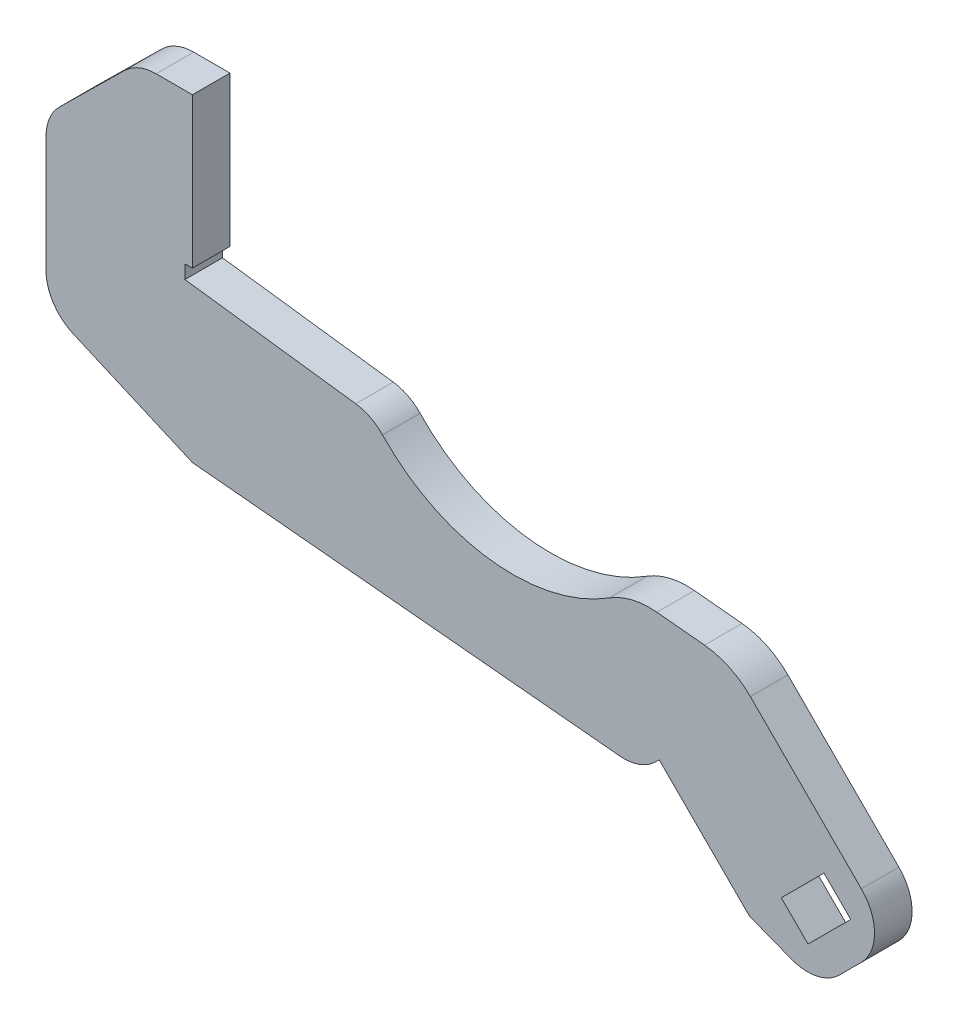
ISO-10303-21;
HEADER;
FILE_DESCRIPTION(('STEP AP214'),'2;1');
FILE_NAME('part.step','',(''),(''),'','','');
FILE_SCHEMA(('AUTOMOTIVE_DESIGN { 1 0 10303 214 1 1 1 1 }'));
ENDSEC;
DATA;
#1=APPLICATION_CONTEXT('core data for automotive mechanical design processes');
#2=APPLICATION_PROTOCOL_DEFINITION('international standard','automotive_design',2000,#1);
#3=PRODUCT_CONTEXT('',#1,'mechanical');
#4=PRODUCT('Part','Part','',(#3));
#5=PRODUCT_RELATED_PRODUCT_CATEGORY('part','',(#4));
#6=PRODUCT_DEFINITION_FORMATION('','',#4);
#7=PRODUCT_DEFINITION_CONTEXT('part definition',#1,'design');
#8=PRODUCT_DEFINITION('design','',#6,#7);
#9=PRODUCT_DEFINITION_SHAPE('','',#8);
#10=(LENGTH_UNIT() NAMED_UNIT(*) SI_UNIT(.MILLI.,.METRE.));
#11=(NAMED_UNIT(*) PLANE_ANGLE_UNIT() SI_UNIT($,.RADIAN.));
#12=(NAMED_UNIT(*) SI_UNIT($,.STERADIAN.) SOLID_ANGLE_UNIT());
#13=UNCERTAINTY_MEASURE_WITH_UNIT(LENGTH_MEASURE(1.E-05),#10,'distance_accuracy_value','');
#14=(GEOMETRIC_REPRESENTATION_CONTEXT(3) GLOBAL_UNCERTAINTY_ASSIGNED_CONTEXT((#13)) GLOBAL_UNIT_ASSIGNED_CONTEXT((#10,
#11,#12)) REPRESENTATION_CONTEXT('',''));
#15=CARTESIAN_POINT('',(0.,0.,0.));
#16=DIRECTION('',(0.,0.,1.));
#17=DIRECTION('',(1.,0.,0.));
#18=AXIS2_PLACEMENT_3D('',#15,#16,#17);
#19=CARTESIAN_POINT('',(2.08387210182843,-1.10005647116688,0.125));
#20=DIRECTION('',(0.,0.,1.));
#21=DIRECTION('',(1.,0.,0.));
#22=AXIS2_PLACEMENT_3D('',#19,#20,#21);
#23=PLANE('',#22);
#24=DIRECTION('',(-0.707106781186548,0.707106781186547,0.));
#25=VECTOR('',#24,1.);
#26=CARTESIAN_POINT('',(4.61670017436695,-3.16430284580979,0.125));
#27=LINE('',#26,#25);
#28=CARTESIAN_POINT('',(4.40456814001099,-2.95217081145382,0.125));
#29=VERTEX_POINT('',#28);
#30=CARTESIAN_POINT('',(3.6654602112381,-2.21306288268094,0.125));
#31=VERTEX_POINT('',#30);
#32=EDGE_CURVE('E317',#29,#31,#27,.T.);
#33=ORIENTED_EDGE('',*,*,#32,.T.);
#34=CARTESIAN_POINT('',(3.31190682064483,-2.56661627327421,0.125));
#35=DIRECTION('',(0.,0.,1.));
#36=DIRECTION('',(1.,0.,0.));
#37=AXIS2_PLACEMENT_3D('',#34,#35,#36);
#38=CIRCLE('',#37,0.5);
#39=CARTESIAN_POINT('',(3.36050678127505,-2.06898383479503,0.125));
#40=VERTEX_POINT('',#39);
#41=EDGE_CURVE('E48',#31,#40,#38,.T.);
#42=ORIENTED_EDGE('',*,*,#41,.T.);
#43=DIRECTION('',(-0.995264876958373,0.0971999212604384,0.));
#44=VECTOR('',#43,1.);
#45=CARTESIAN_POINT('',(3.53879301888837,-2.08639569033121,0.125));
#46=LINE('',#45,#44);
#47=CARTESIAN_POINT('',(3.04306244431306,-2.03798147022694,0.125));
#48=VERTEX_POINT('',#47);
#49=EDGE_CURVE('E320',#40,#48,#46,.T.);
#50=ORIENTED_EDGE('',*,*,#49,.T.);
#51=CARTESIAN_POINT('',(2.99446248368284,-2.53561390870612,0.125));
#52=DIRECTION('',(0.,0.,1.));
#53=DIRECTION('',(1.,0.,0.));
#54=AXIS2_PLACEMENT_3D('',#51,#52,#53);
#55=CIRCLE('',#54,0.5);
#56=CARTESIAN_POINT('',(2.72664178313743,-2.11339113295929,0.125));
#57=VERTEX_POINT('',#56);
#58=EDGE_CURVE('E58',#48,#57,#55,.T.);
#59=ORIENTED_EDGE('',*,*,#58,.T.);
#60=CARTESIAN_POINT('',(2.08387210182843,-1.10005647116688,0.125));
#61=DIRECTION('',(0.,0.,-1.));
#62=DIRECTION('',(1.,0.,0.));
#63=AXIS2_PLACEMENT_3D('',#60,#61,#62);
#64=CIRCLE('',#63,1.2);
#65=CARTESIAN_POINT('',(1.21603766591279,-1.92882869068138,0.125));
#66=VERTEX_POINT('',#65);
#67=EDGE_CURVE('E323',#57,#66,#64,.T.);
#68=ORIENTED_EDGE('',*,*,#67,.T.);
#69=CARTESIAN_POINT('',(0.999079056933884,-2.13602174556001,0.125));
#70=DIRECTION('',(0.,0.,1.));
#71=DIRECTION('',(1.,0.,0.));
#72=AXIS2_PLACEMENT_3D('',#69,#70,#71);
#73=CIRCLE('',#72,0.3);
#74=CARTESIAN_POINT('',(1.03774996099964,-1.83852458392861,0.125));
#75=VERTEX_POINT('',#74);
#76=EDGE_CURVE('E436',#66,#75,#73,.T.);
#77=ORIENTED_EDGE('',*,*,#76,.T.);
#78=DIRECTION('',(-0.991657205437985,0.128903013552536,0.));
#79=VECTOR('',#78,1.);
#80=CARTESIAN_POINT('',(1.14953079393391,-1.85305469185666,0.125));
#81=LINE('',#80,#79);
#82=CARTESIAN_POINT('',(-0.0999999999999998,-1.69063134235492,0.125));
#83=VERTEX_POINT('',#82);
#84=EDGE_CURVE('E326',#75,#83,#81,.T.);
#85=ORIENTED_EDGE('',*,*,#84,.T.);
#86=DIRECTION('',(0.,1.,0.));
#87=VECTOR('',#86,1.);
#88=CARTESIAN_POINT('',(-0.0999999999999998,-1.69063134235492,0.125));
#89=LINE('',#88,#87);
#90=CARTESIAN_POINT('',(-0.0999999999999999,-1.6,0.125));
#91=VERTEX_POINT('',#90);
#92=EDGE_CURVE('E328',#83,#91,#89,.T.);
#93=ORIENTED_EDGE('',*,*,#92,.T.);
#94=DIRECTION('',(1.,0.,0.));
#95=VECTOR('',#94,1.);
#96=CARTESIAN_POINT('',(-0.0999999999999999,-1.6,0.125));
#97=LINE('',#96,#95);
#98=CARTESIAN_POINT('',(-0.0499999999999999,-1.6,0.125));
#99=VERTEX_POINT('',#98);
#100=EDGE_CURVE('E330',#91,#99,#97,.T.);
#101=ORIENTED_EDGE('',*,*,#100,.T.);
#102=DIRECTION('',(0.,1.,0.));
#103=VECTOR('',#102,1.);
#104=CARTESIAN_POINT('',(-0.05,-0.6,0.125));
#105=LINE('',#104,#103);
#106=CARTESIAN_POINT('',(-0.05,-0.6,0.125));
#107=VERTEX_POINT('',#106);
#108=EDGE_CURVE('E332',#99,#107,#105,.T.);
#109=ORIENTED_EDGE('',*,*,#108,.T.);
#110=DIRECTION('',(-1.,0.,0.));
#111=VECTOR('',#110,1.);
#112=CARTESIAN_POINT('',(-0.05,-0.6,0.125));
#113=LINE('',#112,#111);
#114=CARTESIAN_POINT('',(-0.291483111158995,-0.6,0.125));
#115=VERTEX_POINT('',#114);
#116=EDGE_CURVE('E334',#107,#115,#113,.T.);
#117=ORIENTED_EDGE('',*,*,#116,.T.);
#118=CARTESIAN_POINT('',(-0.291483111158995,-0.9,0.125));
#119=DIRECTION('',(0.,0.,1.));
#120=DIRECTION('',(1.,0.,0.));
#121=AXIS2_PLACEMENT_3D('',#118,#119,#120);
#122=CIRCLE('',#121,0.3);
#123=CARTESIAN_POINT('',(-0.502030003317936,-0.686294580784176,0.125));
#124=VERTEX_POINT('',#123);
#125=EDGE_CURVE('E434',#115,#124,#122,.T.);
#126=ORIENTED_EDGE('',*,*,#125,.T.);
#127=DIRECTION('',(-0.712351397386081,-0.701822973863137,0.));
#128=VECTOR('',#127,1.);
#129=CARTESIAN_POINT('',(-0.414440871161026,-0.6,0.125));
#130=LINE('',#129,#128);
#131=CARTESIAN_POINT('',(-0.9355951360967,-1.11345170010297,0.125));
#132=VERTEX_POINT('',#131);
#133=EDGE_CURVE('E337',#124,#132,#130,.T.);
#134=ORIENTED_EDGE('',*,*,#133,.T.);
#135=CARTESIAN_POINT('',(-0.725048243937759,-1.3271571193188,0.125));
#136=DIRECTION('',(0.,0.,1.));
#137=DIRECTION('',(1.,0.,0.));
#138=AXIS2_PLACEMENT_3D('',#135,#136,#137);
#139=CIRCLE('',#138,0.3);
#140=CARTESIAN_POINT('',(-1.02504824393776,-1.3271571193188,0.125));
#141=VERTEX_POINT('',#140);
#142=EDGE_CURVE('E432',#132,#141,#139,.T.);
#143=ORIENTED_EDGE('',*,*,#142,.T.);
#144=DIRECTION('',(0.,-1.,0.));
#145=VECTOR('',#144,1.);
#146=CARTESIAN_POINT('',(-1.02504824393776,-1.20158270735119,0.125));
#147=LINE('',#146,#145);
#148=CARTESIAN_POINT('',(-1.02504824393776,-2.10055389268375,0.125));
#149=VERTEX_POINT('',#148);
#150=EDGE_CURVE('E295',#141,#149,#147,.T.);
#151=ORIENTED_EDGE('',*,*,#150,.T.);
#152=CARTESIAN_POINT('',(-0.725048243937759,-2.10055389268375,0.125));
#153=DIRECTION('',(0.,0.,1.));
#154=DIRECTION('',(1.,0.,0.));
#155=AXIS2_PLACEMENT_3D('',#152,#153,#154);
#156=CIRCLE('',#155,0.3);
#157=CARTESIAN_POINT('',(-0.844664006497766,-2.37567580992625,0.125));
#158=VERTEX_POINT('',#157);
#159=EDGE_CURVE('E430',#149,#158,#156,.T.);
#160=ORIENTED_EDGE('',*,*,#159,.T.);
#161=DIRECTION('',(0.917073057474994,-0.398719208533357,0.));
#162=VECTOR('',#161,1.);
#163=CARTESIAN_POINT('',(-1.02504824393776,-2.29724949503483,0.125));
#164=LINE('',#163,#162);
#165=CARTESIAN_POINT('',(-0.0499999999999999,-2.72117478750293,0.125));
#166=VERTEX_POINT('',#165);
#167=EDGE_CURVE('E298',#158,#166,#164,.T.);
#168=ORIENTED_EDGE('',*,*,#167,.T.);
#169=DIRECTION('',(0.995540801025772,-0.0943319325200388,0.));
#170=VECTOR('',#169,1.);
#171=CARTESIAN_POINT('',(-0.0499999999999999,-2.72117478750293,0.125));
#172=LINE('',#171,#170);
#173=CARTESIAN_POINT('',(2.79504048696555,-2.99075506684124,0.125));
#174=VERTEX_POINT('',#173);
#175=EDGE_CURVE('E301',#166,#174,#172,.T.);
#176=ORIENTED_EDGE('',*,*,#175,.T.);
#177=CARTESIAN_POINT('',(2.82334006672156,-2.69209282653351,0.125));
#178=DIRECTION('',(0.,0.,1.));
#179=DIRECTION('',(1.,0.,0.));
#180=AXIS2_PLACEMENT_3D('',#177,#178,#179);
#181=CIRCLE('',#180,0.3);
#182=CARTESIAN_POINT('',(3.03547210107752,-2.90422486088948,0.125));
#183=VERTEX_POINT('',#182);
#184=EDGE_CURVE('E442',#174,#183,#181,.T.);
#185=ORIENTED_EDGE('',*,*,#184,.T.);
#186=DIRECTION('',(0.707106781186549,0.707106781186546,0.));
#187=VECTOR('',#186,1.);
#188=CARTESIAN_POINT('',(2.93562124143615,-3.00407572053085,0.125));
#189=LINE('',#188,#187);
#190=CARTESIAN_POINT('',(3.05823682863182,-2.88146013333518,0.125));
#191=VERTEX_POINT('',#190);
#192=EDGE_CURVE('E305',#183,#191,#189,.T.);
#193=ORIENTED_EDGE('',*,*,#192,.T.);
#194=DIRECTION('',(0.707106781186547,-0.707106781186547,0.));
#195=VECTOR('',#194,1.);
#196=CARTESIAN_POINT('',(3.05823682863182,-2.88146013333518,0.125));
#197=LINE('',#196,#195);
#198=CARTESIAN_POINT('',(3.65927759264038,-3.48250089734375,0.125));
#199=VERTEX_POINT('',#198);
#200=EDGE_CURVE('E308',#191,#199,#197,.T.);
#201=ORIENTED_EDGE('',*,*,#200,.T.);
#202=DIRECTION('',(0.93275440568332,-0.360512439006419,0.));
#203=VECTOR('',#202,1.);
#204=CARTESIAN_POINT('',(3.65927759264038,-3.48250089734375,0.125));
#205=LINE('',#204,#203);
#206=CARTESIAN_POINT('',(3.93813240410876,-3.59027913735913,0.125));
#207=VERTEX_POINT('',#206);
#208=EDGE_CURVE('E311',#199,#207,#205,.T.);
#209=ORIENTED_EDGE('',*,*,#208,.T.);
#210=CARTESIAN_POINT('',(4.04628613581068,-3.31045281565413,0.125));
#211=DIRECTION('',(0.,0.,1.));
#212=DIRECTION('',(1.,0.,0.));
#213=AXIS2_PLACEMENT_3D('',#210,#211,#212);
#214=CIRCLE('',#213,0.3);
#215=CARTESIAN_POINT('',(4.25841817016665,-3.52258485001009,0.125));
#216=VERTEX_POINT('',#215);
#217=EDGE_CURVE('E438',#207,#216,#214,.T.);
#218=ORIENTED_EDGE('',*,*,#217,.T.);
#219=DIRECTION('',(0.707106781186547,0.707106781186548,0.));
#220=VECTOR('',#219,1.);
#221=CARTESIAN_POINT('',(4.120311213974,-3.66069180620274,0.125));
#222=LINE('',#221,#220);
#223=CARTESIAN_POINT('',(4.40456814001099,-3.37643488016575,0.125));
#224=VERTEX_POINT('',#223);
#225=EDGE_CURVE('E314',#216,#224,#222,.T.);
#226=ORIENTED_EDGE('',*,*,#225,.T.);
#227=CARTESIAN_POINT('',(4.19243610565503,-3.16430284580979,0.125));
#228=DIRECTION('',(0.,0.,1.));
#229=DIRECTION('',(1.,0.,0.));
#230=AXIS2_PLACEMENT_3D('',#227,#228,#229);
#231=CIRCLE('',#230,0.3);
#232=EDGE_CURVE('E440',#224,#29,#231,.T.);
#233=ORIENTED_EDGE('',*,*,#232,.T.);
#234=EDGE_LOOP('',(#33,#42,#50,#59,#68,#77,#85,#93,#101,#109,#117,#126,#134,#143,#151,#160,#168,
#176,#185,#193,#201,#209,#218,#226,#233));
#235=FACE_BOUND('',#234,.T.);
#236=DIRECTION('',(0.707106781186544,-0.707106781186551,0.));
#237=VECTOR('',#236,1.);
#238=CARTESIAN_POINT('',(3.87140962699635,-3.27036886298778,0.125));
#239=LINE('',#238,#237);
#240=CARTESIAN_POINT('',(3.87140962699635,-3.27036886298778,0.125));
#241=VERTEX_POINT('',#240);
#242=CARTESIAN_POINT('',(4.04960053585534,-3.44855977184678,0.125));
#243=VERTEX_POINT('',#242);
#244=EDGE_CURVE('E261',#241,#243,#239,.T.);
#245=ORIENTED_EDGE('',*,*,#244,.F.);
#246=DIRECTION('',(-0.707106781186509,-0.707106781186586,0.));
#247=VECTOR('',#246,1.);
#248=CARTESIAN_POINT('',(3.87140962699635,-3.27036886298778,0.125));
#249=LINE('',#248,#247);
#250=CARTESIAN_POINT('',(4.15566655303332,-2.98611193695078,0.125));
#251=VERTEX_POINT('',#250);
#252=EDGE_CURVE('E251',#251,#241,#249,.T.);
#253=ORIENTED_EDGE('',*,*,#252,.F.);
#254=DIRECTION('',(-0.707106781186543,0.707106781186552,0.));
#255=VECTOR('',#254,1.);
#256=CARTESIAN_POINT('',(4.15566655303332,-2.98611193695078,0.125));
#257=LINE('',#256,#255);
#258=CARTESIAN_POINT('',(4.33385746189233,-3.16430284580979,0.125));
#259=VERTEX_POINT('',#258);
#260=EDGE_CURVE('E277',#259,#251,#257,.T.);
#261=ORIENTED_EDGE('',*,*,#260,.F.);
#262=DIRECTION('',(0.707106781186547,0.707106781186549,0.));
#263=VECTOR('',#262,1.);
#264=CARTESIAN_POINT('',(4.04960053585534,-3.44855977184678,0.125));
#265=LINE('',#264,#263);
#266=EDGE_CURVE('E275',#243,#259,#265,.T.);
#267=ORIENTED_EDGE('',*,*,#266,.F.);
#268=EDGE_LOOP('',(#245,#253,#261,#267));
#269=FACE_BOUND('',#268,.T.);
#270=ADVANCED_FACE('F39',(#235,#269),#23,.T.);
#271=CARTESIAN_POINT('',(2.08387210182843,-1.10005647116688,-0.125));
#272=DIRECTION('',(0.,0.,1.));
#273=DIRECTION('',(1.,0.,0.));
#274=AXIS2_PLACEMENT_3D('',#271,#272,#273);
#275=PLANE('',#274);
#276=DIRECTION('',(-0.995264876958373,0.0971999212604384,0.));
#277=VECTOR('',#276,1.);
#278=CARTESIAN_POINT('',(3.53879301888837,-2.08639569033121,-0.125));
#279=LINE('',#278,#277);
#280=CARTESIAN_POINT('',(3.36050678127505,-2.06898383479503,-0.125));
#281=VERTEX_POINT('',#280);
#282=CARTESIAN_POINT('',(3.04306244431306,-2.03798147022694,-0.125));
#283=VERTEX_POINT('',#282);
#284=EDGE_CURVE('E365',#281,#283,#279,.T.);
#285=ORIENTED_EDGE('',*,*,#284,.F.);
#286=CARTESIAN_POINT('',(3.31190682064483,-2.56661627327421,-0.125));
#287=DIRECTION('',(0.,0.,1.));
#288=DIRECTION('',(1.,0.,0.));
#289=AXIS2_PLACEMENT_3D('',#286,#287,#288);
#290=CIRCLE('',#289,0.5);
#291=CARTESIAN_POINT('',(3.6654602112381,-2.21306288268094,-0.125));
#292=VERTEX_POINT('',#291);
#293=EDGE_CURVE('E486',#281,#292,#290,.F.);
#294=ORIENTED_EDGE('',*,*,#293,.T.);
#295=DIRECTION('',(-0.707106781186548,0.707106781186547,0.));
#296=VECTOR('',#295,1.);
#297=CARTESIAN_POINT('',(4.61670017436695,-3.16430284580979,-0.125));
#298=LINE('',#297,#296);
#299=CARTESIAN_POINT('',(4.40456814001099,-2.95217081145382,-0.125));
#300=VERTEX_POINT('',#299);
#301=EDGE_CURVE('E362',#300,#292,#298,.T.);
#302=ORIENTED_EDGE('',*,*,#301,.F.);
#303=CARTESIAN_POINT('',(4.19243610565503,-3.16430284580979,-0.125));
#304=DIRECTION('',(0.,0.,1.));
#305=DIRECTION('',(1.,0.,0.));
#306=AXIS2_PLACEMENT_3D('',#303,#304,#305);
#307=CIRCLE('',#306,0.3);
#308=CARTESIAN_POINT('',(4.40456814001099,-3.37643488016575,-0.125));
#309=VERTEX_POINT('',#308);
#310=EDGE_CURVE('E422',#300,#309,#307,.F.);
#311=ORIENTED_EDGE('',*,*,#310,.T.);
#312=DIRECTION('',(0.707106781186547,0.707106781186548,0.));
#313=VECTOR('',#312,1.);
#314=CARTESIAN_POINT('',(4.120311213974,-3.66069180620274,-0.125));
#315=LINE('',#314,#313);
#316=CARTESIAN_POINT('',(4.25841817016665,-3.52258485001009,-0.125));
#317=VERTEX_POINT('',#316);
#318=EDGE_CURVE('E359',#317,#309,#315,.T.);
#319=ORIENTED_EDGE('',*,*,#318,.F.);
#320=CARTESIAN_POINT('',(4.04628613581068,-3.31045281565413,-0.125));
#321=DIRECTION('',(0.,0.,1.));
#322=DIRECTION('',(1.,0.,0.));
#323=AXIS2_PLACEMENT_3D('',#320,#321,#322);
#324=CIRCLE('',#323,0.3);
#325=CARTESIAN_POINT('',(3.93813240410876,-3.59027913735913,-0.125));
#326=VERTEX_POINT('',#325);
#327=EDGE_CURVE('E420',#317,#326,#324,.F.);
#328=ORIENTED_EDGE('',*,*,#327,.T.);
#329=DIRECTION('',(0.93275440568332,-0.360512439006419,0.));
#330=VECTOR('',#329,1.);
#331=CARTESIAN_POINT('',(3.65927759264038,-3.48250089734375,-0.125));
#332=LINE('',#331,#330);
#333=CARTESIAN_POINT('',(3.65927759264038,-3.48250089734375,-0.125));
#334=VERTEX_POINT('',#333);
#335=EDGE_CURVE('E355',#334,#326,#332,.T.);
#336=ORIENTED_EDGE('',*,*,#335,.F.);
#337=DIRECTION('',(0.707106781186547,-0.707106781186547,0.));
#338=VECTOR('',#337,1.);
#339=CARTESIAN_POINT('',(3.05823682863182,-2.88146013333518,-0.125));
#340=LINE('',#339,#338);
#341=CARTESIAN_POINT('',(3.05823682863182,-2.88146013333518,-0.125));
#342=VERTEX_POINT('',#341);
#343=EDGE_CURVE('E352',#342,#334,#340,.T.);
#344=ORIENTED_EDGE('',*,*,#343,.F.);
#345=DIRECTION('',(0.707106781186549,0.707106781186546,0.));
#346=VECTOR('',#345,1.);
#347=CARTESIAN_POINT('',(2.93562124143615,-3.00407572053085,-0.125));
#348=LINE('',#347,#346);
#349=CARTESIAN_POINT('',(3.03547210107752,-2.90422486088948,-0.125));
#350=VERTEX_POINT('',#349);
#351=EDGE_CURVE('E349',#350,#342,#348,.T.);
#352=ORIENTED_EDGE('',*,*,#351,.F.);
#353=CARTESIAN_POINT('',(2.82334006672156,-2.69209282653351,-0.125));
#354=DIRECTION('',(0.,0.,1.));
#355=DIRECTION('',(1.,0.,0.));
#356=AXIS2_PLACEMENT_3D('',#353,#354,#355);
#357=CIRCLE('',#356,0.3);
#358=CARTESIAN_POINT('',(2.79504048696555,-2.99075506684124,-0.125));
#359=VERTEX_POINT('',#358);
#360=EDGE_CURVE('E424',#350,#359,#357,.F.);
#361=ORIENTED_EDGE('',*,*,#360,.T.);
#362=DIRECTION('',(0.995540801025772,-0.0943319325200388,0.));
#363=VECTOR('',#362,1.);
#364=CARTESIAN_POINT('',(-0.0499999999999999,-2.72117478750293,-0.125));
#365=LINE('',#364,#363);
#366=CARTESIAN_POINT('',(-0.0499999999999999,-2.72117478750293,-0.125));
#367=VERTEX_POINT('',#366);
#368=EDGE_CURVE('E345',#367,#359,#365,.T.);
#369=ORIENTED_EDGE('',*,*,#368,.F.);
#370=DIRECTION('',(0.917073057474994,-0.398719208533357,0.));
#371=VECTOR('',#370,1.);
#372=CARTESIAN_POINT('',(-1.02504824393776,-2.29724949503483,-0.125));
#373=LINE('',#372,#371);
#374=CARTESIAN_POINT('',(-0.844664006497766,-2.37567580992625,-0.125));
#375=VERTEX_POINT('',#374);
#376=EDGE_CURVE('E343',#375,#367,#373,.T.);
#377=ORIENTED_EDGE('',*,*,#376,.F.);
#378=CARTESIAN_POINT('',(-0.725048243937759,-2.10055389268375,-0.125));
#379=DIRECTION('',(0.,0.,1.));
#380=DIRECTION('',(1.,0.,0.));
#381=AXIS2_PLACEMENT_3D('',#378,#379,#380);
#382=CIRCLE('',#381,0.3);
#383=CARTESIAN_POINT('',(-1.02504824393776,-2.10055389268375,-0.125));
#384=VERTEX_POINT('',#383);
#385=EDGE_CURVE('E411',#375,#384,#382,.F.);
#386=ORIENTED_EDGE('',*,*,#385,.T.);
#387=DIRECTION('',(0.,-1.,0.));
#388=VECTOR('',#387,1.);
#389=CARTESIAN_POINT('',(-1.02504824393776,-1.20158270735119,-0.125));
#390=LINE('',#389,#388);
#391=CARTESIAN_POINT('',(-1.02504824393776,-1.3271571193188,-0.125));
#392=VERTEX_POINT('',#391);
#393=EDGE_CURVE('E270',#392,#384,#390,.T.);
#394=ORIENTED_EDGE('',*,*,#393,.F.);
#395=CARTESIAN_POINT('',(-0.725048243937759,-1.3271571193188,-0.125));
#396=DIRECTION('',(0.,0.,1.));
#397=DIRECTION('',(1.,0.,0.));
#398=AXIS2_PLACEMENT_3D('',#395,#396,#397);
#399=CIRCLE('',#398,0.3);
#400=CARTESIAN_POINT('',(-0.9355951360967,-1.11345170010297,-0.125));
#401=VERTEX_POINT('',#400);
#402=EDGE_CURVE('E413',#392,#401,#399,.F.);
#403=ORIENTED_EDGE('',*,*,#402,.T.);
#404=DIRECTION('',(-0.712351397386081,-0.701822973863137,0.));
#405=VECTOR('',#404,1.);
#406=CARTESIAN_POINT('',(-0.414440871161026,-0.6,-0.125));
#407=LINE('',#406,#405);
#408=CARTESIAN_POINT('',(-0.502030003317936,-0.686294580784176,-0.125));
#409=VERTEX_POINT('',#408);
#410=EDGE_CURVE('E299',#409,#401,#407,.T.);
#411=ORIENTED_EDGE('',*,*,#410,.F.);
#412=CARTESIAN_POINT('',(-0.291483111158995,-0.9,-0.125));
#413=DIRECTION('',(0.,0.,1.));
#414=DIRECTION('',(1.,0.,0.));
#415=AXIS2_PLACEMENT_3D('',#412,#413,#414);
#416=CIRCLE('',#415,0.3);
#417=CARTESIAN_POINT('',(-0.291483111158995,-0.6,-0.125));
#418=VERTEX_POINT('',#417);
#419=EDGE_CURVE('E415',#409,#418,#416,.F.);
#420=ORIENTED_EDGE('',*,*,#419,.T.);
#421=DIRECTION('',(-1.,0.,0.));
#422=VECTOR('',#421,1.);
#423=CARTESIAN_POINT('',(-0.05,-0.6,-0.125));
#424=LINE('',#423,#422);
#425=CARTESIAN_POINT('',(-0.05,-0.6,-0.125));
#426=VERTEX_POINT('',#425);
#427=EDGE_CURVE('E380',#426,#418,#424,.T.);
#428=ORIENTED_EDGE('',*,*,#427,.F.);
#429=DIRECTION('',(0.,1.,0.));
#430=VECTOR('',#429,1.);
#431=CARTESIAN_POINT('',(-0.05,-0.6,-0.125));
#432=LINE('',#431,#430);
#433=CARTESIAN_POINT('',(-0.0499999999999999,-1.6,-0.125));
#434=VERTEX_POINT('',#433);
#435=EDGE_CURVE('E378',#434,#426,#432,.T.);
#436=ORIENTED_EDGE('',*,*,#435,.F.);
#437=DIRECTION('',(1.,0.,0.));
#438=VECTOR('',#437,1.);
#439=CARTESIAN_POINT('',(-0.0999999999999999,-1.6,-0.125));
#440=LINE('',#439,#438);
#441=CARTESIAN_POINT('',(-0.0999999999999999,-1.6,-0.125));
#442=VERTEX_POINT('',#441);
#443=EDGE_CURVE('E376',#442,#434,#440,.T.);
#444=ORIENTED_EDGE('',*,*,#443,.F.);
#445=DIRECTION('',(0.,1.,0.));
#446=VECTOR('',#445,1.);
#447=CARTESIAN_POINT('',(-0.0999999999999998,-1.69063134235492,-0.125));
#448=LINE('',#447,#446);
#449=CARTESIAN_POINT('',(-0.0999999999999998,-1.69063134235492,-0.125));
#450=VERTEX_POINT('',#449);
#451=EDGE_CURVE('E374',#450,#442,#448,.T.);
#452=ORIENTED_EDGE('',*,*,#451,.F.);
#453=DIRECTION('',(-0.991657205437985,0.128903013552536,0.));
#454=VECTOR('',#453,1.);
#455=CARTESIAN_POINT('',(1.14953079393391,-1.85305469185666,-0.125));
#456=LINE('',#455,#454);
#457=CARTESIAN_POINT('',(1.03774996099964,-1.83852458392861,-0.125));
#458=VERTEX_POINT('',#457);
#459=EDGE_CURVE('E372',#458,#450,#456,.T.);
#460=ORIENTED_EDGE('',*,*,#459,.F.);
#461=CARTESIAN_POINT('',(0.999079056933884,-2.13602174556001,-0.125));
#462=DIRECTION('',(0.,0.,1.));
#463=DIRECTION('',(1.,0.,0.));
#464=AXIS2_PLACEMENT_3D('',#461,#462,#463);
#465=CIRCLE('',#464,0.3);
#466=CARTESIAN_POINT('',(1.21603766591279,-1.92882869068138,-0.125));
#467=VERTEX_POINT('',#466);
#468=EDGE_CURVE('E417',#458,#467,#465,.F.);
#469=ORIENTED_EDGE('',*,*,#468,.T.);
#470=CARTESIAN_POINT('',(2.08387210182843,-1.10005647116688,-0.125));
#471=DIRECTION('',(0.,0.,-1.));
#472=DIRECTION('',(1.,0.,0.));
#473=AXIS2_PLACEMENT_3D('',#470,#471,#472);
#474=CIRCLE('',#473,1.2);
#475=CARTESIAN_POINT('',(2.72664178313743,-2.11339113295929,-0.125));
#476=VERTEX_POINT('',#475);
#477=EDGE_CURVE('E369',#476,#467,#474,.T.);
#478=ORIENTED_EDGE('',*,*,#477,.F.);
#479=CARTESIAN_POINT('',(2.99446248368284,-2.53561390870612,-0.125));
#480=DIRECTION('',(0.,0.,1.));
#481=DIRECTION('',(1.,0.,0.));
#482=AXIS2_PLACEMENT_3D('',#479,#480,#481);
#483=CIRCLE('',#482,0.5);
#484=EDGE_CURVE('E483',#476,#283,#483,.F.);
#485=ORIENTED_EDGE('',*,*,#484,.T.);
#486=EDGE_LOOP('',(#285,#294,#302,#311,#319,#328,#336,#344,#352,#361,#369,#377,#386,#394,#403,
#411,#420,#428,#436,#444,#452,#460,#469,#478,#485));
#487=FACE_BOUND('',#486,.T.);
#488=DIRECTION('',(-0.707106781186509,-0.707106781186586,0.));
#489=VECTOR('',#488,1.);
#490=CARTESIAN_POINT('',(3.87140962699635,-3.27036886298778,-0.125));
#491=LINE('',#490,#489);
#492=CARTESIAN_POINT('',(4.15566655303332,-2.98611193695078,-0.125));
#493=VERTEX_POINT('',#492);
#494=CARTESIAN_POINT('',(3.87140962699635,-3.27036886298778,-0.125));
#495=VERTEX_POINT('',#494);
#496=EDGE_CURVE('E281',#493,#495,#491,.T.);
#497=ORIENTED_EDGE('',*,*,#496,.T.);
#498=DIRECTION('',(0.707106781186544,-0.707106781186551,0.));
#499=VECTOR('',#498,1.);
#500=CARTESIAN_POINT('',(3.87140962699635,-3.27036886298778,-0.125));
#501=LINE('',#500,#499);
#502=CARTESIAN_POINT('',(4.04960053585534,-3.44855977184678,-0.125));
#503=VERTEX_POINT('',#502);
#504=EDGE_CURVE('E268',#495,#503,#501,.T.);
#505=ORIENTED_EDGE('',*,*,#504,.T.);
#506=DIRECTION('',(0.707106781186547,0.707106781186549,0.));
#507=VECTOR('',#506,1.);
#508=CARTESIAN_POINT('',(4.04960053585534,-3.44855977184678,-0.125));
#509=LINE('',#508,#507);
#510=CARTESIAN_POINT('',(4.33385746189233,-3.16430284580979,-0.125));
#511=VERTEX_POINT('',#510);
#512=EDGE_CURVE('E286',#503,#511,#509,.T.);
#513=ORIENTED_EDGE('',*,*,#512,.T.);
#514=DIRECTION('',(-0.707106781186543,0.707106781186552,0.));
#515=VECTOR('',#514,1.);
#516=CARTESIAN_POINT('',(4.15566655303332,-2.98611193695078,-0.125));
#517=LINE('',#516,#515);
#518=EDGE_CURVE('E262',#511,#493,#517,.T.);
#519=ORIENTED_EDGE('',*,*,#518,.T.);
#520=EDGE_LOOP('',(#497,#505,#513,#519));
#521=FACE_BOUND('',#520,.T.);
#522=ADVANCED_FACE('F504',(#487,#521),#275,.F.);
#523=CARTESIAN_POINT('',(-1.02504824393776,-1.20158270735119,0.125));
#524=DIRECTION('',(1.,0.,0.));
#525=DIRECTION('',(0.,0.,-1.));
#526=AXIS2_PLACEMENT_3D('',#523,#524,#525);
#527=PLANE('',#526);
#528=ORIENTED_EDGE('',*,*,#150,.F.);
#529=DIRECTION('',(0.,0.,-1.));
#530=VECTOR('',#529,1.);
#531=CARTESIAN_POINT('',(-1.02504824393776,-1.3271571193188,0.125));
#532=LINE('',#531,#530);
#533=EDGE_CURVE('E470',#141,#392,#532,.T.);
#534=ORIENTED_EDGE('',*,*,#533,.T.);
#535=ORIENTED_EDGE('',*,*,#393,.T.);
#536=DIRECTION('',(0.,0.,-1.));
#537=VECTOR('',#536,1.);
#538=CARTESIAN_POINT('',(-1.02504824393776,-2.10055389268375,0.125));
#539=LINE('',#538,#537);
#540=EDGE_CURVE('E468',#384,#149,#539,.F.);
#541=ORIENTED_EDGE('',*,*,#540,.T.);
#542=EDGE_LOOP('',(#528,#534,#535,#541));
#543=FACE_BOUND('',#542,.T.);
#544=ADVANCED_FACE('F556',(#543),#527,.F.);
#545=CARTESIAN_POINT('',(-1.02504824393776,-2.29724949503483,0.125));
#546=DIRECTION('',(0.398719208533357,0.917073057474994,0.));
#547=DIRECTION('',(-0.917073057474994,0.398719208533357,0.));
#548=AXIS2_PLACEMENT_3D('',#545,#546,#547);
#549=PLANE('',#548);
#550=ORIENTED_EDGE('',*,*,#167,.F.);
#551=DIRECTION('',(0.,0.,-1.));
#552=VECTOR('',#551,1.);
#553=CARTESIAN_POINT('',(-0.844664006497766,-2.37567580992625,0.125));
#554=LINE('',#553,#552);
#555=EDGE_CURVE('E473',#158,#375,#554,.T.);
#556=ORIENTED_EDGE('',*,*,#555,.T.);
#557=ORIENTED_EDGE('',*,*,#376,.T.);
#558=DIRECTION('',(0.,0.,-1.));
#559=VECTOR('',#558,1.);
#560=CARTESIAN_POINT('',(-0.0499999999999999,-2.72117478750293,0.125));
#561=LINE('',#560,#559);
#562=EDGE_CURVE('E404',#166,#367,#561,.T.);
#563=ORIENTED_EDGE('',*,*,#562,.F.);
#564=EDGE_LOOP('',(#550,#556,#557,#563));
#565=FACE_BOUND('',#564,.T.);
#566=ADVANCED_FACE('F549',(#565),#549,.F.);
#567=CARTESIAN_POINT('',(-0.0499999999999999,-2.72117478750293,0.125));
#568=DIRECTION('',(0.0943319325200388,0.995540801025772,0.));
#569=DIRECTION('',(-0.995540801025772,0.0943319325200388,0.));
#570=AXIS2_PLACEMENT_3D('',#567,#568,#569);
#571=PLANE('',#570);
#572=ORIENTED_EDGE('',*,*,#368,.T.);
#573=DIRECTION('',(0.,0.,-1.));
#574=VECTOR('',#573,1.);
#575=CARTESIAN_POINT('',(2.79504048696555,-2.99075506684124,0.125));
#576=LINE('',#575,#574);
#577=EDGE_CURVE('E427',#359,#174,#576,.F.);
#578=ORIENTED_EDGE('',*,*,#577,.T.);
#579=ORIENTED_EDGE('',*,*,#175,.F.);
#580=ORIENTED_EDGE('',*,*,#562,.T.);
#581=EDGE_LOOP('',(#572,#578,#579,#580));
#582=FACE_BOUND('',#581,.T.);
#583=ADVANCED_FACE('F543',(#582),#571,.F.);
#584=CARTESIAN_POINT('',(2.93562124143615,-3.00407572053085,0.125));
#585=DIRECTION('',(-0.707106781186546,0.707106781186549,0.));
#586=DIRECTION('',(-0.707106781186549,-0.707106781186546,0.));
#587=AXIS2_PLACEMENT_3D('',#584,#585,#586);
#588=PLANE('',#587);
#589=ORIENTED_EDGE('',*,*,#192,.F.);
#590=DIRECTION('',(0.,0.,-1.));
#591=VECTOR('',#590,1.);
#592=CARTESIAN_POINT('',(3.03547210107752,-2.90422486088948,0.125));
#593=LINE('',#592,#591);
#594=EDGE_CURVE('E407',#183,#350,#593,.T.);
#595=ORIENTED_EDGE('',*,*,#594,.T.);
#596=ORIENTED_EDGE('',*,*,#351,.T.);
#597=DIRECTION('',(0.,0.,-1.));
#598=VECTOR('',#597,1.);
#599=CARTESIAN_POINT('',(3.05823682863182,-2.88146013333518,0.125));
#600=LINE('',#599,#598);
#601=EDGE_CURVE('E400',#191,#342,#600,.T.);
#602=ORIENTED_EDGE('',*,*,#601,.F.);
#603=EDGE_LOOP('',(#589,#595,#596,#602));
#604=FACE_BOUND('',#603,.T.);
#605=ADVANCED_FACE('F535',(#604),#588,.F.);
#606=CARTESIAN_POINT('',(3.05823682863182,-2.88146013333518,0.125));
#607=DIRECTION('',(0.707106781186547,0.707106781186547,0.));
#608=DIRECTION('',(-0.707106781186548,0.707106781186548,0.));
#609=AXIS2_PLACEMENT_3D('',#606,#607,#608);
#610=PLANE('',#609);
#611=ORIENTED_EDGE('',*,*,#343,.T.);
#612=DIRECTION('',(0.,0.,-1.));
#613=VECTOR('',#612,1.);
#614=CARTESIAN_POINT('',(3.65927759264038,-3.48250089734375,0.125));
#615=LINE('',#614,#613);
#616=EDGE_CURVE('E396',#199,#334,#615,.T.);
#617=ORIENTED_EDGE('',*,*,#616,.F.);
#618=ORIENTED_EDGE('',*,*,#200,.F.);
#619=ORIENTED_EDGE('',*,*,#601,.T.);
#620=EDGE_LOOP('',(#611,#617,#618,#619));
#621=FACE_BOUND('',#620,.T.);
#622=ADVANCED_FACE('F529',(#621),#610,.F.);
#623=CARTESIAN_POINT('',(3.65927759264038,-3.48250089734375,0.125));
#624=DIRECTION('',(0.360512439006419,0.93275440568332,0.));
#625=DIRECTION('',(-0.93275440568332,0.360512439006419,0.));
#626=AXIS2_PLACEMENT_3D('',#623,#624,#625);
#627=PLANE('',#626);
#628=ORIENTED_EDGE('',*,*,#335,.T.);
#629=DIRECTION('',(0.,0.,-1.));
#630=VECTOR('',#629,1.);
#631=CARTESIAN_POINT('',(3.93813240410876,-3.59027913735913,0.125));
#632=LINE('',#631,#630);
#633=EDGE_CURVE('E453',#326,#207,#632,.F.);
#634=ORIENTED_EDGE('',*,*,#633,.T.);
#635=ORIENTED_EDGE('',*,*,#208,.F.);
#636=ORIENTED_EDGE('',*,*,#616,.T.);
#637=EDGE_LOOP('',(#628,#634,#635,#636));
#638=FACE_BOUND('',#637,.T.);
#639=ADVANCED_FACE('F524',(#638),#627,.F.);
#640=CARTESIAN_POINT('',(4.120311213974,-3.66069180620274,0.125));
#641=DIRECTION('',(-0.707106781186548,0.707106781186547,0.));
#642=DIRECTION('',(-0.707106781186547,-0.707106781186548,0.));
#643=AXIS2_PLACEMENT_3D('',#640,#641,#642);
#644=PLANE('',#643);
#645=ORIENTED_EDGE('',*,*,#318,.T.);
#646=DIRECTION('',(0.,0.,-1.));
#647=VECTOR('',#646,1.);
#648=CARTESIAN_POINT('',(4.40456814001099,-3.37643488016575,0.125));
#649=LINE('',#648,#647);
#650=EDGE_CURVE('E451',#309,#224,#649,.F.);
#651=ORIENTED_EDGE('',*,*,#650,.T.);
#652=ORIENTED_EDGE('',*,*,#225,.F.);
#653=DIRECTION('',(0.,0.,-1.));
#654=VECTOR('',#653,1.);
#655=CARTESIAN_POINT('',(4.25841817016665,-3.52258485001009,0.125));
#656=LINE('',#655,#654);
#657=EDGE_CURVE('E448',#216,#317,#656,.T.);
#658=ORIENTED_EDGE('',*,*,#657,.T.);
#659=EDGE_LOOP('',(#645,#651,#652,#658));
#660=FACE_BOUND('',#659,.T.);
#661=ADVANCED_FACE('F514',(#660),#644,.F.);
#662=CARTESIAN_POINT('',(4.61670017436695,-3.16430284580979,0.125));
#663=DIRECTION('',(-0.707106781186547,-0.707106781186548,0.));
#664=DIRECTION('',(0.707106781186548,-0.707106781186547,0.));
#665=AXIS2_PLACEMENT_3D('',#662,#663,#664);
#666=PLANE('',#665);
#667=ORIENTED_EDGE('',*,*,#301,.T.);
#668=DIRECTION('',(0.,0.,-1.));
#669=VECTOR('',#668,1.);
#670=CARTESIAN_POINT('',(3.6654602112381,-2.21306288268094,0.125));
#671=LINE('',#670,#669);
#672=EDGE_CURVE('E68',#292,#31,#671,.F.);
#673=ORIENTED_EDGE('',*,*,#672,.T.);
#674=ORIENTED_EDGE('',*,*,#32,.F.);
#675=DIRECTION('',(0.,0.,-1.));
#676=VECTOR('',#675,1.);
#677=CARTESIAN_POINT('',(4.40456814001099,-2.95217081145382,0.125));
#678=LINE('',#677,#676);
#679=EDGE_CURVE('E445',#29,#300,#678,.T.);
#680=ORIENTED_EDGE('',*,*,#679,.T.);
#681=EDGE_LOOP('',(#667,#673,#674,#680));
#682=FACE_BOUND('',#681,.T.);
#683=ADVANCED_FACE('F506',(#682),#666,.F.);
#684=CARTESIAN_POINT('',(3.53879301888837,-2.08639569033121,0.125));
#685=DIRECTION('',(-0.0971999212604384,-0.995264876958373,0.));
#686=DIRECTION('',(0.995264876958373,-0.0971999212604384,0.));
#687=AXIS2_PLACEMENT_3D('',#684,#685,#686);
#688=PLANE('',#687);
#689=ORIENTED_EDGE('',*,*,#49,.F.);
#690=DIRECTION('',(0.,0.,-1.));
#691=VECTOR('',#690,1.);
#692=CARTESIAN_POINT('',(3.36050678127505,-2.06898383479503,0.125));
#693=LINE('',#692,#691);
#694=EDGE_CURVE('E479',#40,#281,#693,.T.);
#695=ORIENTED_EDGE('',*,*,#694,.T.);
#696=ORIENTED_EDGE('',*,*,#284,.T.);
#697=DIRECTION('',(0.,0.,-1.));
#698=VECTOR('',#697,1.);
#699=CARTESIAN_POINT('',(3.04306244431306,-2.03798147022694,0.125));
#700=LINE('',#699,#698);
#701=EDGE_CURVE('E476',#283,#48,#700,.F.);
#702=ORIENTED_EDGE('',*,*,#701,.T.);
#703=EDGE_LOOP('',(#689,#695,#696,#702));
#704=FACE_BOUND('',#703,.T.);
#705=ADVANCED_FACE('F498',(#704),#688,.F.);
#706=CARTESIAN_POINT('',(2.08387210182843,-1.10005647116688,0.125));
#707=DIRECTION('',(0.,0.,-1.));
#708=DIRECTION('',(-1.,0.,0.));
#709=AXIS2_PLACEMENT_3D('',#706,#707,#708);
#710=CYLINDRICAL_SURFACE('',#709,1.2);
#711=ORIENTED_EDGE('',*,*,#67,.F.);
#712=DIRECTION('',(0.,0.,-1.));
#713=VECTOR('',#712,1.);
#714=CARTESIAN_POINT('',(2.72664178313743,-2.11339113295929,0.125));
#715=LINE('',#714,#713);
#716=EDGE_CURVE('E11',#57,#476,#715,.T.);
#717=ORIENTED_EDGE('',*,*,#716,.T.);
#718=ORIENTED_EDGE('',*,*,#477,.T.);
#719=DIRECTION('',(0.,0.,-1.));
#720=VECTOR('',#719,1.);
#721=CARTESIAN_POINT('',(1.21603766591279,-1.92882869068138,0.125));
#722=LINE('',#721,#720);
#723=EDGE_CURVE('E458',#467,#66,#722,.F.);
#724=ORIENTED_EDGE('',*,*,#723,.T.);
#725=EDGE_LOOP('',(#711,#717,#718,#724));
#726=FACE_BOUND('',#725,.T.);
#727=ADVANCED_FACE('F601',(#726),#710,.F.);
#728=CARTESIAN_POINT('',(1.14953079393391,-1.85305469185666,0.125));
#729=DIRECTION('',(-0.128903013552536,-0.991657205437985,0.));
#730=DIRECTION('',(0.991657205437985,-0.128903013552536,0.));
#731=AXIS2_PLACEMENT_3D('',#728,#729,#730);
#732=PLANE('',#731);
#733=ORIENTED_EDGE('',*,*,#84,.F.);
#734=DIRECTION('',(0.,0.,-1.));
#735=VECTOR('',#734,1.);
#736=CARTESIAN_POINT('',(1.03774996099964,-1.83852458392861,0.125));
#737=LINE('',#736,#735);
#738=EDGE_CURVE('E455',#75,#458,#737,.T.);
#739=ORIENTED_EDGE('',*,*,#738,.T.);
#740=ORIENTED_EDGE('',*,*,#459,.T.);
#741=DIRECTION('',(0.,0.,-1.));
#742=VECTOR('',#741,1.);
#743=CARTESIAN_POINT('',(-0.0999999999999998,-1.69063134235492,0.125));
#744=LINE('',#743,#742);
#745=EDGE_CURVE('E393',#83,#450,#744,.T.);
#746=ORIENTED_EDGE('',*,*,#745,.F.);
#747=EDGE_LOOP('',(#733,#739,#740,#746));
#748=FACE_BOUND('',#747,.T.);
#749=ADVANCED_FACE('F597',(#748),#732,.F.);
#750=CARTESIAN_POINT('',(-0.0999999999999998,-1.69063134235492,0.125));
#751=DIRECTION('',(-1.,0.,0.));
#752=DIRECTION('',(0.,-1.,0.));
#753=AXIS2_PLACEMENT_3D('',#750,#751,#752);
#754=PLANE('',#753);
#755=ORIENTED_EDGE('',*,*,#451,.T.);
#756=DIRECTION('',(0.,0.,-1.));
#757=VECTOR('',#756,1.);
#758=CARTESIAN_POINT('',(-0.0999999999999999,-1.6,0.125));
#759=LINE('',#758,#757);
#760=EDGE_CURVE('E390',#91,#442,#759,.T.);
#761=ORIENTED_EDGE('',*,*,#760,.F.);
#762=ORIENTED_EDGE('',*,*,#92,.F.);
#763=ORIENTED_EDGE('',*,*,#745,.T.);
#764=EDGE_LOOP('',(#755,#761,#762,#763));
#765=FACE_BOUND('',#764,.T.);
#766=ADVANCED_FACE('F593',(#765),#754,.F.);
#767=CARTESIAN_POINT('',(-0.0999999999999999,-1.6,0.125));
#768=DIRECTION('',(0.,1.,0.));
#769=DIRECTION('',(0.,0.,1.));
#770=AXIS2_PLACEMENT_3D('',#767,#768,#769);
#771=PLANE('',#770);
#772=ORIENTED_EDGE('',*,*,#443,.T.);
#773=DIRECTION('',(0.,0.,-1.));
#774=VECTOR('',#773,1.);
#775=CARTESIAN_POINT('',(-0.0499999999999999,-1.6,0.125));
#776=LINE('',#775,#774);
#777=EDGE_CURVE('E387',#99,#434,#776,.T.);
#778=ORIENTED_EDGE('',*,*,#777,.F.);
#779=ORIENTED_EDGE('',*,*,#100,.F.);
#780=ORIENTED_EDGE('',*,*,#760,.T.);
#781=EDGE_LOOP('',(#772,#778,#779,#780));
#782=FACE_BOUND('',#781,.T.);
#783=ADVANCED_FACE('F589',(#782),#771,.F.);
#784=CARTESIAN_POINT('',(-0.05,-0.6,0.125));
#785=DIRECTION('',(-1.,0.,0.));
#786=DIRECTION('',(0.,-1.,0.));
#787=AXIS2_PLACEMENT_3D('',#784,#785,#786);
#788=PLANE('',#787);
#789=ORIENTED_EDGE('',*,*,#435,.T.);
#790=DIRECTION('',(0.,0.,-1.));
#791=VECTOR('',#790,1.);
#792=CARTESIAN_POINT('',(-0.05,-0.6,0.125));
#793=LINE('',#792,#791);
#794=EDGE_CURVE('E340',#107,#426,#793,.T.);
#795=ORIENTED_EDGE('',*,*,#794,.F.);
#796=ORIENTED_EDGE('',*,*,#108,.F.);
#797=ORIENTED_EDGE('',*,*,#777,.T.);
#798=EDGE_LOOP('',(#789,#795,#796,#797));
#799=FACE_BOUND('',#798,.T.);
#800=ADVANCED_FACE('F585',(#799),#788,.F.);
#801=CARTESIAN_POINT('',(-0.05,-0.6,0.125));
#802=DIRECTION('',(0.,-1.,0.));
#803=DIRECTION('',(0.,0.,-1.));
#804=AXIS2_PLACEMENT_3D('',#801,#802,#803);
#805=PLANE('',#804);
#806=ORIENTED_EDGE('',*,*,#427,.T.);
#807=DIRECTION('',(0.,0.,-1.));
#808=VECTOR('',#807,1.);
#809=CARTESIAN_POINT('',(-0.291483111158995,-0.6,0.125));
#810=LINE('',#809,#808);
#811=EDGE_CURVE('E466',#418,#115,#810,.F.);
#812=ORIENTED_EDGE('',*,*,#811,.T.);
#813=ORIENTED_EDGE('',*,*,#116,.F.);
#814=ORIENTED_EDGE('',*,*,#794,.T.);
#815=EDGE_LOOP('',(#806,#812,#813,#814));
#816=FACE_BOUND('',#815,.T.);
#817=ADVANCED_FACE('F581',(#816),#805,.F.);
#818=CARTESIAN_POINT('',(-0.414440871161026,-0.6,0.125));
#819=DIRECTION('',(0.701822973863137,-0.712351397386081,0.));
#820=DIRECTION('',(0.712351397386081,0.701822973863137,0.));
#821=AXIS2_PLACEMENT_3D('',#818,#819,#820);
#822=PLANE('',#821);
#823=ORIENTED_EDGE('',*,*,#133,.F.);
#824=DIRECTION('',(0.,0.,-1.));
#825=VECTOR('',#824,1.);
#826=CARTESIAN_POINT('',(-0.502030003317936,-0.686294580784176,0.125));
#827=LINE('',#826,#825);
#828=EDGE_CURVE('E463',#124,#409,#827,.T.);
#829=ORIENTED_EDGE('',*,*,#828,.T.);
#830=ORIENTED_EDGE('',*,*,#410,.T.);
#831=DIRECTION('',(0.,0.,-1.));
#832=VECTOR('',#831,1.);
#833=CARTESIAN_POINT('',(-0.9355951360967,-1.11345170010297,0.125));
#834=LINE('',#833,#832);
#835=EDGE_CURVE('E461',#401,#132,#834,.F.);
#836=ORIENTED_EDGE('',*,*,#835,.T.);
#837=EDGE_LOOP('',(#823,#829,#830,#836));
#838=FACE_BOUND('',#837,.T.);
#839=ADVANCED_FACE('F578',(#838),#822,.F.);
#840=CARTESIAN_POINT('',(3.87140962699635,-3.27036886298778,0.125));
#841=DIRECTION('',(0.707106781186586,-0.707106781186509,0.));
#842=DIRECTION('',(0.707106781186509,0.707106781186586,0.));
#843=AXIS2_PLACEMENT_3D('',#840,#841,#842);
#844=PLANE('',#843);
#845=ORIENTED_EDGE('',*,*,#496,.F.);
#846=DIRECTION('',(0.,0.,-1.));
#847=VECTOR('',#846,1.);
#848=CARTESIAN_POINT('',(4.15566655303332,-2.98611193695078,0.125));
#849=LINE('',#848,#847);
#850=EDGE_CURVE('E257',#251,#493,#849,.T.);
#851=ORIENTED_EDGE('',*,*,#850,.F.);
#852=ORIENTED_EDGE('',*,*,#252,.T.);
#853=DIRECTION('',(0.,0.,-1.));
#854=VECTOR('',#853,1.);
#855=CARTESIAN_POINT('',(3.87140962699635,-3.27036886298778,0.125));
#856=LINE('',#855,#854);
#857=EDGE_CURVE('E254',#241,#495,#856,.T.);
#858=ORIENTED_EDGE('',*,*,#857,.T.);
#859=EDGE_LOOP('',(#845,#851,#852,#858));
#860=FACE_BOUND('',#859,.T.);
#861=ADVANCED_FACE('F253',(#860),#844,.T.);
#862=CARTESIAN_POINT('',(3.87140962699635,-3.27036886298778,0.125));
#863=DIRECTION('',(0.707106781186551,0.707106781186544,0.));
#864=DIRECTION('',(-0.707106781186544,0.707106781186551,0.));
#865=AXIS2_PLACEMENT_3D('',#862,#863,#864);
#866=PLANE('',#865);
#867=ORIENTED_EDGE('',*,*,#504,.F.);
#868=ORIENTED_EDGE('',*,*,#857,.F.);
#869=ORIENTED_EDGE('',*,*,#244,.T.);
#870=DIRECTION('',(0.,0.,-1.));
#871=VECTOR('',#870,1.);
#872=CARTESIAN_POINT('',(4.04960053585534,-3.44855977184678,0.125));
#873=LINE('',#872,#871);
#874=EDGE_CURVE('E271',#243,#503,#873,.T.);
#875=ORIENTED_EDGE('',*,*,#874,.T.);
#876=EDGE_LOOP('',(#867,#868,#869,#875));
#877=FACE_BOUND('',#876,.T.);
#878=ADVANCED_FACE('F265',(#877),#866,.T.);
#879=CARTESIAN_POINT('',(4.04960053585534,-3.44855977184678,0.125));
#880=DIRECTION('',(-0.707106781186549,0.707106781186547,0.));
#881=DIRECTION('',(-0.707106781186546,-0.707106781186549,0.));
#882=AXIS2_PLACEMENT_3D('',#879,#880,#881);
#883=PLANE('',#882);
#884=ORIENTED_EDGE('',*,*,#512,.F.);
#885=ORIENTED_EDGE('',*,*,#874,.F.);
#886=ORIENTED_EDGE('',*,*,#266,.T.);
#887=DIRECTION('',(0.,0.,-1.));
#888=VECTOR('',#887,1.);
#889=CARTESIAN_POINT('',(4.33385746189233,-3.16430284580979,0.125));
#890=LINE('',#889,#888);
#891=EDGE_CURVE('E292',#259,#511,#890,.T.);
#892=ORIENTED_EDGE('',*,*,#891,.T.);
#893=EDGE_LOOP('',(#884,#885,#886,#892));
#894=FACE_BOUND('',#893,.T.);
#895=ADVANCED_FACE('F808',(#894),#883,.T.);
#896=CARTESIAN_POINT('',(4.15566655303332,-2.98611193695078,0.125));
#897=DIRECTION('',(-0.707106781186552,-0.707106781186543,0.));
#898=DIRECTION('',(0.707106781186543,-0.707106781186552,0.));
#899=AXIS2_PLACEMENT_3D('',#896,#897,#898);
#900=PLANE('',#899);
#901=ORIENTED_EDGE('',*,*,#518,.F.);
#902=ORIENTED_EDGE('',*,*,#891,.F.);
#903=ORIENTED_EDGE('',*,*,#260,.T.);
#904=ORIENTED_EDGE('',*,*,#850,.T.);
#905=EDGE_LOOP('',(#901,#902,#903,#904));
#906=FACE_BOUND('',#905,.T.);
#907=ADVANCED_FACE('F626',(#906),#900,.T.);
#908=CARTESIAN_POINT('',(2.82334006672156,-2.69209282653351,0.125));
#909=DIRECTION('',(0.,0.,-1.));
#910=DIRECTION('',(-1.,0.,0.));
#911=AXIS2_PLACEMENT_3D('',#908,#909,#910);
#912=CYLINDRICAL_SURFACE('',#911,0.3);
#913=ORIENTED_EDGE('',*,*,#184,.F.);
#914=ORIENTED_EDGE('',*,*,#577,.F.);
#915=ORIENTED_EDGE('',*,*,#360,.F.);
#916=ORIENTED_EDGE('',*,*,#594,.F.);
#917=EDGE_LOOP('',(#913,#914,#915,#916));
#918=FACE_BOUND('',#917,.T.);
#919=ADVANCED_FACE('F539',(#918),#912,.T.);
#920=CARTESIAN_POINT('',(4.19243610565503,-3.16430284580979,0.125));
#921=DIRECTION('',(0.,0.,-1.));
#922=DIRECTION('',(-1.,0.,0.));
#923=AXIS2_PLACEMENT_3D('',#920,#921,#922);
#924=CYLINDRICAL_SURFACE('',#923,0.3);
#925=ORIENTED_EDGE('',*,*,#232,.F.);
#926=ORIENTED_EDGE('',*,*,#650,.F.);
#927=ORIENTED_EDGE('',*,*,#310,.F.);
#928=ORIENTED_EDGE('',*,*,#679,.F.);
#929=EDGE_LOOP('',(#925,#926,#927,#928));
#930=FACE_BOUND('',#929,.T.);
#931=ADVANCED_FACE('F510',(#930),#924,.T.);
#932=CARTESIAN_POINT('',(4.04628613581068,-3.31045281565413,0.125));
#933=DIRECTION('',(0.,0.,-1.));
#934=DIRECTION('',(-1.,0.,0.));
#935=AXIS2_PLACEMENT_3D('',#932,#933,#934);
#936=CYLINDRICAL_SURFACE('',#935,0.3);
#937=ORIENTED_EDGE('',*,*,#217,.F.);
#938=ORIENTED_EDGE('',*,*,#633,.F.);
#939=ORIENTED_EDGE('',*,*,#327,.F.);
#940=ORIENTED_EDGE('',*,*,#657,.F.);
#941=EDGE_LOOP('',(#937,#938,#939,#940));
#942=FACE_BOUND('',#941,.T.);
#943=ADVANCED_FACE('F519',(#942),#936,.T.);
#944=CARTESIAN_POINT('',(0.999079056933884,-2.13602174556001,0.125));
#945=DIRECTION('',(0.,0.,-1.));
#946=DIRECTION('',(-1.,0.,0.));
#947=AXIS2_PLACEMENT_3D('',#944,#945,#946);
#948=CYLINDRICAL_SURFACE('',#947,0.3);
#949=ORIENTED_EDGE('',*,*,#76,.F.);
#950=ORIENTED_EDGE('',*,*,#723,.F.);
#951=ORIENTED_EDGE('',*,*,#468,.F.);
#952=ORIENTED_EDGE('',*,*,#738,.F.);
#953=EDGE_LOOP('',(#949,#950,#951,#952));
#954=FACE_BOUND('',#953,.T.);
#955=ADVANCED_FACE('F631',(#954),#948,.T.);
#956=CARTESIAN_POINT('',(-0.291483111158995,-0.9,0.125));
#957=DIRECTION('',(0.,0.,-1.));
#958=DIRECTION('',(-1.,0.,0.));
#959=AXIS2_PLACEMENT_3D('',#956,#957,#958);
#960=CYLINDRICAL_SURFACE('',#959,0.3);
#961=ORIENTED_EDGE('',*,*,#125,.F.);
#962=ORIENTED_EDGE('',*,*,#811,.F.);
#963=ORIENTED_EDGE('',*,*,#419,.F.);
#964=ORIENTED_EDGE('',*,*,#828,.F.);
#965=EDGE_LOOP('',(#961,#962,#963,#964));
#966=FACE_BOUND('',#965,.T.);
#967=ADVANCED_FACE('F566',(#966),#960,.T.);
#968=CARTESIAN_POINT('',(-0.725048243937759,-1.3271571193188,0.125));
#969=DIRECTION('',(0.,0.,-1.));
#970=DIRECTION('',(-1.,0.,0.));
#971=AXIS2_PLACEMENT_3D('',#968,#969,#970);
#972=CYLINDRICAL_SURFACE('',#971,0.3);
#973=ORIENTED_EDGE('',*,*,#142,.F.);
#974=ORIENTED_EDGE('',*,*,#835,.F.);
#975=ORIENTED_EDGE('',*,*,#402,.F.);
#976=ORIENTED_EDGE('',*,*,#533,.F.);
#977=EDGE_LOOP('',(#973,#974,#975,#976));
#978=FACE_BOUND('',#977,.T.);
#979=ADVANCED_FACE('F560',(#978),#972,.T.);
#980=CARTESIAN_POINT('',(-0.725048243937759,-2.10055389268375,0.125));
#981=DIRECTION('',(0.,0.,-1.));
#982=DIRECTION('',(-1.,0.,0.));
#983=AXIS2_PLACEMENT_3D('',#980,#981,#982);
#984=CYLINDRICAL_SURFACE('',#983,0.3);
#985=ORIENTED_EDGE('',*,*,#159,.F.);
#986=ORIENTED_EDGE('',*,*,#540,.F.);
#987=ORIENTED_EDGE('',*,*,#385,.F.);
#988=ORIENTED_EDGE('',*,*,#555,.F.);
#989=EDGE_LOOP('',(#985,#986,#987,#988));
#990=FACE_BOUND('',#989,.T.);
#991=ADVANCED_FACE('F558',(#990),#984,.T.);
#992=CARTESIAN_POINT('',(3.31190682064483,-2.56661627327421,0.125));
#993=DIRECTION('',(0.,0.,-1.));
#994=DIRECTION('',(-1.,0.,0.));
#995=AXIS2_PLACEMENT_3D('',#992,#993,#994);
#996=CYLINDRICAL_SURFACE('',#995,0.5);
#997=ORIENTED_EDGE('',*,*,#41,.F.);
#998=ORIENTED_EDGE('',*,*,#672,.F.);
#999=ORIENTED_EDGE('',*,*,#293,.F.);
#1000=ORIENTED_EDGE('',*,*,#694,.F.);
#1001=EDGE_LOOP('',(#997,#998,#999,#1000));
#1002=FACE_BOUND('',#1001,.T.);
#1003=ADVANCED_FACE('F501',(#1002),#996,.T.);
#1004=CARTESIAN_POINT('',(2.99446248368284,-2.53561390870612,0.125));
#1005=DIRECTION('',(0.,0.,-1.));
#1006=DIRECTION('',(-1.,0.,0.));
#1007=AXIS2_PLACEMENT_3D('',#1004,#1005,#1006);
#1008=CYLINDRICAL_SURFACE('',#1007,0.5);
#1009=ORIENTED_EDGE('',*,*,#58,.F.);
#1010=ORIENTED_EDGE('',*,*,#701,.F.);
#1011=ORIENTED_EDGE('',*,*,#484,.F.);
#1012=ORIENTED_EDGE('',*,*,#716,.F.);
#1013=EDGE_LOOP('',(#1009,#1010,#1011,#1012));
#1014=FACE_BOUND('',#1013,.T.);
#1015=ADVANCED_FACE('F41',(#1014),#1008,.T.);
#1016=CLOSED_SHELL('',(#270,#522,#544,#566,#583,#605,#622,#639,#661,#683,#705,#727,#749,#766,
#783,#800,#817,#839,#861,#878,#895,#907,#919,#931,#943,#955,#967,#979,#991,#1003,#1015));
#1017=MANIFOLD_SOLID_BREP('B2',#1016);
#1018=ADVANCED_BREP_SHAPE_REPRESENTATION('',(#18,#1017),#14);
#1019=SHAPE_DEFINITION_REPRESENTATION(#9,#1018);
ENDSEC;
END-ISO-10303-21;
